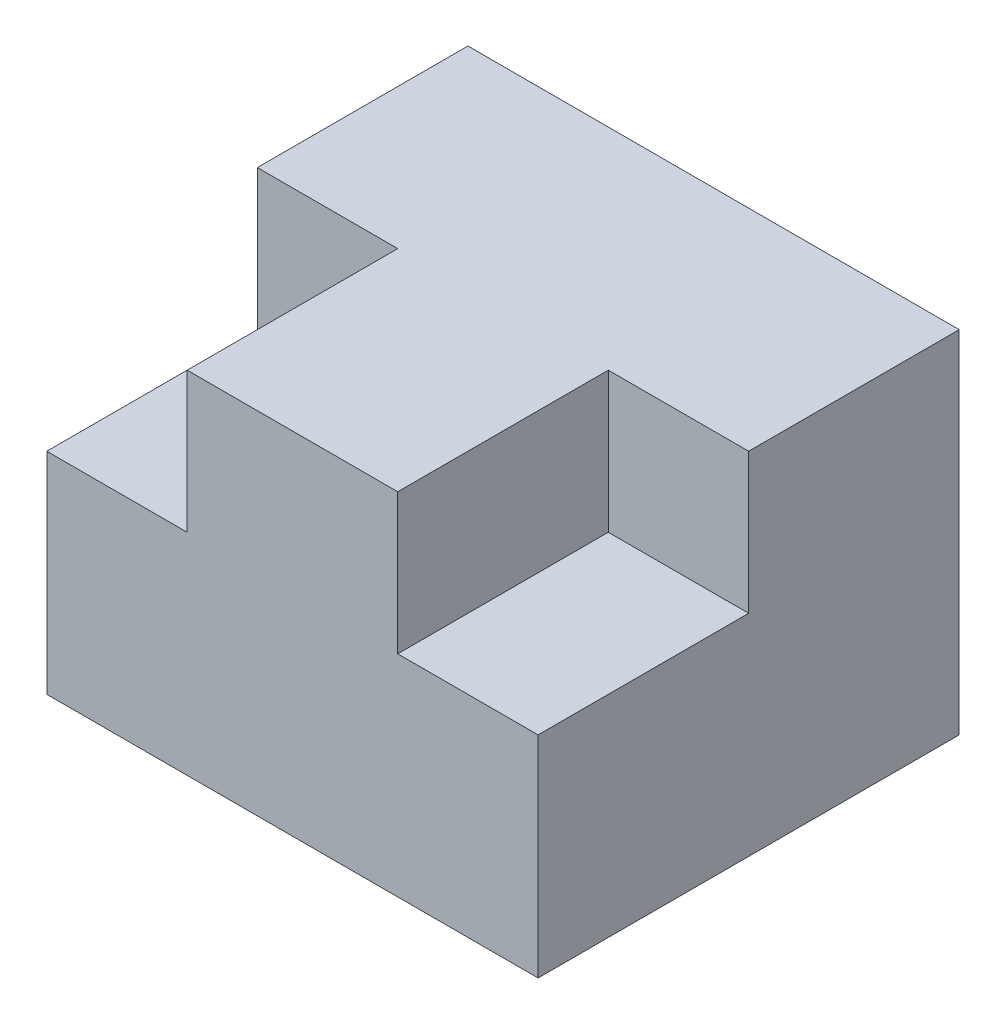
ISO-10303-21;
HEADER;
FILE_DESCRIPTION(('STEP AP214'),'2;1');
FILE_NAME('part.step','',(''),(''),'','','');
FILE_SCHEMA(('AUTOMOTIVE_DESIGN { 1 0 10303 214 1 1 1 1 }'));
ENDSEC;
DATA;
#1=APPLICATION_CONTEXT('core data for automotive mechanical design processes');
#2=APPLICATION_PROTOCOL_DEFINITION('international standard','automotive_design',2000,#1);
#3=PRODUCT_CONTEXT('',#1,'mechanical');
#4=PRODUCT('Part','Part','',(#3));
#5=PRODUCT_RELATED_PRODUCT_CATEGORY('part','',(#4));
#6=PRODUCT_DEFINITION_FORMATION('','',#4);
#7=PRODUCT_DEFINITION_CONTEXT('part definition',#1,'design');
#8=PRODUCT_DEFINITION('design','',#6,#7);
#9=PRODUCT_DEFINITION_SHAPE('','',#8);
#10=(LENGTH_UNIT() NAMED_UNIT(*) SI_UNIT(.MILLI.,.METRE.));
#11=(NAMED_UNIT(*) PLANE_ANGLE_UNIT() SI_UNIT($,.RADIAN.));
#12=(NAMED_UNIT(*) SI_UNIT($,.STERADIAN.) SOLID_ANGLE_UNIT());
#13=UNCERTAINTY_MEASURE_WITH_UNIT(LENGTH_MEASURE(1.E-05),#10,'distance_accuracy_value','');
#14=(GEOMETRIC_REPRESENTATION_CONTEXT(3) GLOBAL_UNCERTAINTY_ASSIGNED_CONTEXT((#13)) GLOBAL_UNIT_ASSIGNED_CONTEXT((#10,
#11,#12)) REPRESENTATION_CONTEXT('',''));
#15=CARTESIAN_POINT('',(0.,0.,0.));
#16=DIRECTION('',(0.,0.,1.));
#17=DIRECTION('',(1.,0.,0.));
#18=AXIS2_PLACEMENT_3D('',#15,#16,#17);
#19=CARTESIAN_POINT('',(17.5,15.,15.));
#20=DIRECTION('',(0.,-1.,0.));
#21=DIRECTION('',(1.,0.,0.));
#22=AXIS2_PLACEMENT_3D('',#19,#20,#21);
#23=PLANE('',#22);
#24=DIRECTION('',(-1.,0.,0.));
#25=VECTOR('',#24,1.);
#26=CARTESIAN_POINT('',(17.5,15.,0.));
#27=LINE('',#26,#25);
#28=CARTESIAN_POINT('',(17.5,15.,0.));
#29=VERTEX_POINT('',#28);
#30=CARTESIAN_POINT('',(7.5,15.,0.));
#31=VERTEX_POINT('',#30);
#32=EDGE_CURVE('E146',#29,#31,#27,.T.);
#33=ORIENTED_EDGE('',*,*,#32,.T.);
#34=DIRECTION('',(0.,0.,-1.));
#35=VECTOR('',#34,1.);
#36=CARTESIAN_POINT('',(7.5,15.,15.));
#37=LINE('',#36,#35);
#38=CARTESIAN_POINT('',(7.5,15.,15.));
#39=VERTEX_POINT('',#38);
#40=EDGE_CURVE('E11',#39,#31,#37,.T.);
#41=ORIENTED_EDGE('',*,*,#40,.F.);
#42=DIRECTION('',(-1.,0.,0.));
#43=VECTOR('',#42,1.);
#44=CARTESIAN_POINT('',(17.5,15.,15.));
#45=LINE('',#44,#43);
#46=CARTESIAN_POINT('',(17.5,15.,15.));
#47=VERTEX_POINT('',#46);
#48=EDGE_CURVE('E147',#47,#39,#45,.T.);
#49=ORIENTED_EDGE('',*,*,#48,.F.);
#50=DIRECTION('',(0.,0.,-1.));
#51=VECTOR('',#50,1.);
#52=CARTESIAN_POINT('',(17.5,15.,15.));
#53=LINE('',#52,#51);
#54=EDGE_CURVE('E114',#47,#29,#53,.T.);
#55=ORIENTED_EDGE('',*,*,#54,.T.);
#56=EDGE_LOOP('',(#33,#41,#49,#55));
#57=FACE_BOUND('',#56,.T.);
#58=ADVANCED_FACE('F33',(#57),#23,.F.);
#59=CARTESIAN_POINT('',(7.5,15.,15.));
#60=DIRECTION('',(-1.,0.,0.));
#61=DIRECTION('',(0.,-1.,0.));
#62=AXIS2_PLACEMENT_3D('',#59,#60,#61);
#63=PLANE('',#62);
#64=DIRECTION('',(0.,1.,0.));
#65=VECTOR('',#64,1.);
#66=CARTESIAN_POINT('',(7.5,15.,0.));
#67=LINE('',#66,#65);
#68=CARTESIAN_POINT('',(7.5,25.,0.));
#69=VERTEX_POINT('',#68);
#70=EDGE_CURVE('E165',#31,#69,#67,.T.);
#71=ORIENTED_EDGE('',*,*,#70,.T.);
#72=DIRECTION('',(0.,0.,-1.));
#73=VECTOR('',#72,1.);
#74=CARTESIAN_POINT('',(7.5,25.,15.));
#75=LINE('',#74,#73);
#76=CARTESIAN_POINT('',(7.5,25.,15.));
#77=VERTEX_POINT('',#76);
#78=EDGE_CURVE('E41',#77,#69,#75,.T.);
#79=ORIENTED_EDGE('',*,*,#78,.F.);
#80=DIRECTION('',(0.,1.,0.));
#81=VECTOR('',#80,1.);
#82=CARTESIAN_POINT('',(7.5,15.,15.));
#83=LINE('',#82,#81);
#84=EDGE_CURVE('E149',#39,#77,#83,.T.);
#85=ORIENTED_EDGE('',*,*,#84,.F.);
#86=ORIENTED_EDGE('',*,*,#40,.T.);
#87=EDGE_LOOP('',(#71,#79,#85,#86));
#88=FACE_BOUND('',#87,.T.);
#89=ADVANCED_FACE('F192',(#88),#63,.F.);
#90=CARTESIAN_POINT('',(7.5,25.,15.));
#91=DIRECTION('',(0.,-1.,0.));
#92=DIRECTION('',(1.,0.,0.));
#93=AXIS2_PLACEMENT_3D('',#90,#91,#92);
#94=PLANE('',#93);
#95=ORIENTED_EDGE('',*,*,#78,.T.);
#96=DIRECTION('',(1.,0.,0.));
#97=VECTOR('',#96,1.);
#98=CARTESIAN_POINT('',(17.5,25.,0.));
#99=LINE('',#98,#97);
#100=CARTESIAN_POINT('',(17.5,25.,0.));
#101=VERTEX_POINT('',#100);
#102=EDGE_CURVE('E131',#69,#101,#99,.T.);
#103=ORIENTED_EDGE('',*,*,#102,.T.);
#104=DIRECTION('',(0.,0.,1.));
#105=VECTOR('',#104,1.);
#106=CARTESIAN_POINT('',(17.5,25.,-15.));
#107=LINE('',#106,#105);
#108=CARTESIAN_POINT('',(17.5,25.,-15.));
#109=VERTEX_POINT('',#108);
#110=EDGE_CURVE('E136',#109,#101,#107,.T.);
#111=ORIENTED_EDGE('',*,*,#110,.F.);
#112=DIRECTION('',(1.,0.,0.));
#113=VECTOR('',#112,1.);
#114=CARTESIAN_POINT('',(17.5,25.,-15.));
#115=LINE('',#114,#113);
#116=CARTESIAN_POINT('',(-17.5,25.,-15.));
#117=VERTEX_POINT('',#116);
#118=EDGE_CURVE('E126',#117,#109,#115,.T.);
#119=ORIENTED_EDGE('',*,*,#118,.F.);
#120=DIRECTION('',(0.,0.,1.));
#121=VECTOR('',#120,1.);
#122=CARTESIAN_POINT('',(-17.5,25.,-15.));
#123=LINE('',#122,#121);
#124=CARTESIAN_POINT('',(-17.5,25.,0.));
#125=VERTEX_POINT('',#124);
#126=EDGE_CURVE('E143',#117,#125,#123,.T.);
#127=ORIENTED_EDGE('',*,*,#126,.T.);
#128=CARTESIAN_POINT('',(-7.50000000000001,25.,0.));
#129=VERTEX_POINT('',#128);
#130=EDGE_CURVE('E128',#125,#129,#99,.T.);
#131=ORIENTED_EDGE('',*,*,#130,.T.);
#132=DIRECTION('',(0.,0.,-1.));
#133=VECTOR('',#132,1.);
#134=CARTESIAN_POINT('',(-7.50000000000001,25.,15.));
#135=LINE('',#134,#133);
#136=CARTESIAN_POINT('',(-7.50000000000001,25.,15.));
#137=VERTEX_POINT('',#136);
#138=EDGE_CURVE('E182',#137,#129,#135,.T.);
#139=ORIENTED_EDGE('',*,*,#138,.F.);
#140=DIRECTION('',(-1.,0.,0.));
#141=VECTOR('',#140,1.);
#142=CARTESIAN_POINT('',(7.5,25.,15.));
#143=LINE('',#142,#141);
#144=EDGE_CURVE('E152',#77,#137,#143,.T.);
#145=ORIENTED_EDGE('',*,*,#144,.F.);
#146=EDGE_LOOP('',(#95,#103,#111,#119,#127,#131,#139,#145));
#147=FACE_BOUND('',#146,.T.);
#148=ADVANCED_FACE('F188',(#147),#94,.F.);
#149=CARTESIAN_POINT('',(-7.50000000000001,25.,15.));
#150=DIRECTION('',(1.,0.,0.));
#151=DIRECTION('',(0.,1.,0.));
#152=AXIS2_PLACEMENT_3D('',#149,#150,#151);
#153=PLANE('',#152);
#154=DIRECTION('',(0.,-1.,0.));
#155=VECTOR('',#154,1.);
#156=CARTESIAN_POINT('',(-7.50000000000001,25.,0.));
#157=LINE('',#156,#155);
#158=CARTESIAN_POINT('',(-7.5,15.,0.));
#159=VERTEX_POINT('',#158);
#160=EDGE_CURVE('E168',#129,#159,#157,.T.);
#161=ORIENTED_EDGE('',*,*,#160,.T.);
#162=DIRECTION('',(0.,0.,-1.));
#163=VECTOR('',#162,1.);
#164=CARTESIAN_POINT('',(-7.5,15.,15.));
#165=LINE('',#164,#163);
#166=CARTESIAN_POINT('',(-7.5,15.,15.));
#167=VERTEX_POINT('',#166);
#168=EDGE_CURVE('E179',#167,#159,#165,.T.);
#169=ORIENTED_EDGE('',*,*,#168,.F.);
#170=DIRECTION('',(0.,-1.,0.));
#171=VECTOR('',#170,1.);
#172=CARTESIAN_POINT('',(-7.50000000000001,25.,15.));
#173=LINE('',#172,#171);
#174=EDGE_CURVE('E154',#137,#167,#173,.T.);
#175=ORIENTED_EDGE('',*,*,#174,.F.);
#176=ORIENTED_EDGE('',*,*,#138,.T.);
#177=EDGE_LOOP('',(#161,#169,#175,#176));
#178=FACE_BOUND('',#177,.T.);
#179=ADVANCED_FACE('F204',(#178),#153,.F.);
#180=CARTESIAN_POINT('',(-7.5,15.,15.));
#181=DIRECTION('',(0.,-1.,0.));
#182=DIRECTION('',(0.,0.,-1.));
#183=AXIS2_PLACEMENT_3D('',#180,#181,#182);
#184=PLANE('',#183);
#185=DIRECTION('',(-1.,0.,0.));
#186=VECTOR('',#185,1.);
#187=CARTESIAN_POINT('',(-7.5,15.,0.));
#188=LINE('',#187,#186);
#189=CARTESIAN_POINT('',(-17.5,15.,0.));
#190=VERTEX_POINT('',#189);
#191=EDGE_CURVE('E150',#159,#190,#188,.T.);
#192=ORIENTED_EDGE('',*,*,#191,.T.);
#193=DIRECTION('',(0.,0.,-1.));
#194=VECTOR('',#193,1.);
#195=CARTESIAN_POINT('',(-17.5,15.,15.));
#196=LINE('',#195,#194);
#197=CARTESIAN_POINT('',(-17.5,15.,15.));
#198=VERTEX_POINT('',#197);
#199=EDGE_CURVE('E176',#198,#190,#196,.T.);
#200=ORIENTED_EDGE('',*,*,#199,.F.);
#201=DIRECTION('',(-1.,0.,0.));
#202=VECTOR('',#201,1.);
#203=CARTESIAN_POINT('',(-7.5,15.,15.));
#204=LINE('',#203,#202);
#205=EDGE_CURVE('E156',#167,#198,#204,.T.);
#206=ORIENTED_EDGE('',*,*,#205,.F.);
#207=ORIENTED_EDGE('',*,*,#168,.T.);
#208=EDGE_LOOP('',(#192,#200,#206,#207));
#209=FACE_BOUND('',#208,.T.);
#210=ADVANCED_FACE('F208',(#209),#184,.F.);
#211=CARTESIAN_POINT('',(-17.5,15.,15.));
#212=DIRECTION('',(1.,0.,0.));
#213=DIRECTION('',(0.,0.,-1.));
#214=AXIS2_PLACEMENT_3D('',#211,#212,#213);
#215=PLANE('',#214);
#216=ORIENTED_EDGE('',*,*,#199,.T.);
#217=DIRECTION('',(0.,1.,0.));
#218=VECTOR('',#217,1.);
#219=CARTESIAN_POINT('',(-17.5,0.,0.));
#220=LINE('',#219,#218);
#221=EDGE_CURVE('E140',#190,#125,#220,.T.);
#222=ORIENTED_EDGE('',*,*,#221,.T.);
#223=ORIENTED_EDGE('',*,*,#126,.F.);
#224=DIRECTION('',(0.,1.,0.));
#225=VECTOR('',#224,1.);
#226=CARTESIAN_POINT('',(-17.5,0.,-15.));
#227=LINE('',#226,#225);
#228=CARTESIAN_POINT('',(-17.5,0.,-15.));
#229=VERTEX_POINT('',#228);
#230=EDGE_CURVE('E122',#229,#117,#227,.T.);
#231=ORIENTED_EDGE('',*,*,#230,.F.);
#232=DIRECTION('',(0.,0.,-1.));
#233=VECTOR('',#232,1.);
#234=CARTESIAN_POINT('',(-17.5,0.,15.));
#235=LINE('',#234,#233);
#236=CARTESIAN_POINT('',(-17.5,0.,15.));
#237=VERTEX_POINT('',#236);
#238=EDGE_CURVE('E113',#237,#229,#235,.T.);
#239=ORIENTED_EDGE('',*,*,#238,.F.);
#240=DIRECTION('',(0.,-1.,0.));
#241=VECTOR('',#240,1.);
#242=CARTESIAN_POINT('',(-17.5,15.,15.));
#243=LINE('',#242,#241);
#244=EDGE_CURVE('E158',#198,#237,#243,.T.);
#245=ORIENTED_EDGE('',*,*,#244,.F.);
#246=EDGE_LOOP('',(#216,#222,#223,#231,#239,#245));
#247=FACE_BOUND('',#246,.T.);
#248=ADVANCED_FACE('F211',(#247),#215,.F.);
#249=CARTESIAN_POINT('',(-17.5,0.,15.));
#250=DIRECTION('',(0.,1.,0.));
#251=DIRECTION('',(0.,0.,1.));
#252=AXIS2_PLACEMENT_3D('',#249,#250,#251);
#253=PLANE('',#252);
#254=ORIENTED_EDGE('',*,*,#238,.T.);
#255=DIRECTION('',(-1.,0.,0.));
#256=VECTOR('',#255,1.);
#257=CARTESIAN_POINT('',(17.5,0.,-15.));
#258=LINE('',#257,#256);
#259=CARTESIAN_POINT('',(17.5,0.,-15.));
#260=VERTEX_POINT('',#259);
#261=EDGE_CURVE('E117',#260,#229,#258,.T.);
#262=ORIENTED_EDGE('',*,*,#261,.F.);
#263=DIRECTION('',(0.,0.,-1.));
#264=VECTOR('',#263,1.);
#265=CARTESIAN_POINT('',(17.5,0.,15.));
#266=LINE('',#265,#264);
#267=CARTESIAN_POINT('',(17.5,0.,15.));
#268=VERTEX_POINT('',#267);
#269=EDGE_CURVE('E105',#268,#260,#266,.T.);
#270=ORIENTED_EDGE('',*,*,#269,.F.);
#271=DIRECTION('',(1.,0.,0.));
#272=VECTOR('',#271,1.);
#273=CARTESIAN_POINT('',(-17.5,0.,15.));
#274=LINE('',#273,#272);
#275=EDGE_CURVE('E160',#237,#268,#274,.T.);
#276=ORIENTED_EDGE('',*,*,#275,.F.);
#277=EDGE_LOOP('',(#254,#262,#270,#276));
#278=FACE_BOUND('',#277,.T.);
#279=ADVANCED_FACE('F118',(#278),#253,.F.);
#280=CARTESIAN_POINT('',(17.5,0.,15.));
#281=DIRECTION('',(-1.,0.,0.));
#282=DIRECTION('',(0.,0.,1.));
#283=AXIS2_PLACEMENT_3D('',#280,#281,#282);
#284=PLANE('',#283);
#285=ORIENTED_EDGE('',*,*,#269,.T.);
#286=DIRECTION('',(0.,-1.,0.));
#287=VECTOR('',#286,1.);
#288=CARTESIAN_POINT('',(17.5,0.,-15.));
#289=LINE('',#288,#287);
#290=EDGE_CURVE('E110',#109,#260,#289,.T.);
#291=ORIENTED_EDGE('',*,*,#290,.F.);
#292=ORIENTED_EDGE('',*,*,#110,.T.);
#293=DIRECTION('',(0.,-1.,0.));
#294=VECTOR('',#293,1.);
#295=CARTESIAN_POINT('',(17.5,0.,0.));
#296=LINE('',#295,#294);
#297=EDGE_CURVE('E137',#101,#29,#296,.T.);
#298=ORIENTED_EDGE('',*,*,#297,.T.);
#299=ORIENTED_EDGE('',*,*,#54,.F.);
#300=DIRECTION('',(0.,1.,0.));
#301=VECTOR('',#300,1.);
#302=CARTESIAN_POINT('',(17.5,0.,15.));
#303=LINE('',#302,#301);
#304=EDGE_CURVE('E48',#268,#47,#303,.T.);
#305=ORIENTED_EDGE('',*,*,#304,.F.);
#306=EDGE_LOOP('',(#285,#291,#292,#298,#299,#305));
#307=FACE_BOUND('',#306,.T.);
#308=ADVANCED_FACE('F107',(#307),#284,.F.);
#309=CARTESIAN_POINT('',(0.,0.,15.));
#310=DIRECTION('',(0.,0.,-1.));
#311=DIRECTION('',(-1.,0.,0.));
#312=AXIS2_PLACEMENT_3D('',#309,#310,#311);
#313=PLANE('',#312);
#314=ORIENTED_EDGE('',*,*,#48,.T.);
#315=ORIENTED_EDGE('',*,*,#84,.T.);
#316=ORIENTED_EDGE('',*,*,#144,.T.);
#317=ORIENTED_EDGE('',*,*,#174,.T.);
#318=ORIENTED_EDGE('',*,*,#205,.T.);
#319=ORIENTED_EDGE('',*,*,#244,.T.);
#320=ORIENTED_EDGE('',*,*,#275,.T.);
#321=ORIENTED_EDGE('',*,*,#304,.T.);
#322=EDGE_LOOP('',(#314,#315,#316,#317,#318,#319,#320,#321));
#323=FACE_BOUND('',#322,.T.);
#324=ADVANCED_FACE('F199',(#323),#313,.F.);
#325=CARTESIAN_POINT('',(0.,0.,0.));
#326=DIRECTION('',(0.,0.,1.));
#327=DIRECTION('',(1.,0.,0.));
#328=AXIS2_PLACEMENT_3D('',#325,#326,#327);
#329=PLANE('',#328);
#330=ORIENTED_EDGE('',*,*,#191,.F.);
#331=ORIENTED_EDGE('',*,*,#160,.F.);
#332=ORIENTED_EDGE('',*,*,#130,.F.);
#333=ORIENTED_EDGE('',*,*,#221,.F.);
#334=EDGE_LOOP('',(#330,#331,#332,#333));
#335=FACE_BOUND('',#334,.T.);
#336=ADVANCED_FACE('F214',(#335),#329,.T.);
#337=ORIENTED_EDGE('',*,*,#32,.F.);
#338=ORIENTED_EDGE('',*,*,#297,.F.);
#339=ORIENTED_EDGE('',*,*,#102,.F.);
#340=ORIENTED_EDGE('',*,*,#70,.F.);
#341=EDGE_LOOP('',(#337,#338,#339,#340));
#342=FACE_BOUND('',#341,.T.);
#343=ADVANCED_FACE('F195',(#342),#329,.T.);
#344=CARTESIAN_POINT('',(0.,0.,-15.));
#345=DIRECTION('',(0.,0.,1.));
#346=DIRECTION('',(1.,0.,0.));
#347=AXIS2_PLACEMENT_3D('',#344,#345,#346);
#348=PLANE('',#347);
#349=ORIENTED_EDGE('',*,*,#290,.T.);
#350=ORIENTED_EDGE('',*,*,#261,.T.);
#351=ORIENTED_EDGE('',*,*,#230,.T.);
#352=ORIENTED_EDGE('',*,*,#118,.T.);
#353=EDGE_LOOP('',(#349,#350,#351,#352));
#354=FACE_BOUND('',#353,.T.);
#355=ADVANCED_FACE('F124',(#354),#348,.F.);
#356=CLOSED_SHELL('',(#58,#89,#148,#179,#210,#248,#279,#308,#324,#336,#343,#355));
#357=MANIFOLD_SOLID_BREP('B2',#356);
#358=ADVANCED_BREP_SHAPE_REPRESENTATION('',(#18,#357),#14);
#359=SHAPE_DEFINITION_REPRESENTATION(#9,#358);
ENDSEC;
END-ISO-10303-21;
